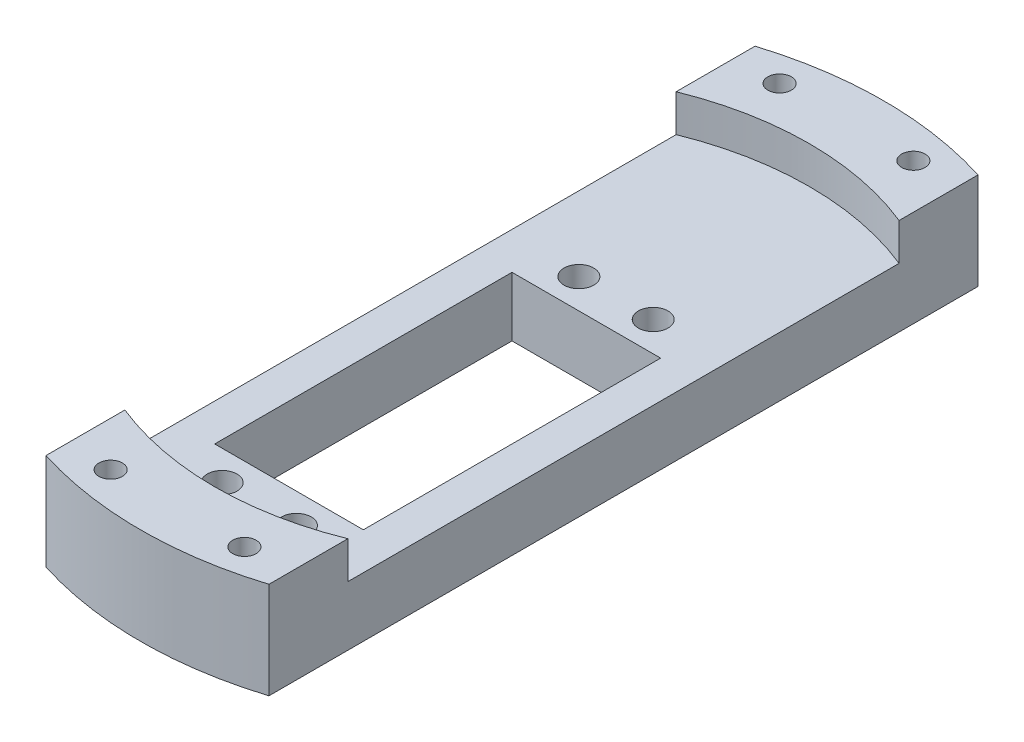
ISO-10303-21;
HEADER;
FILE_DESCRIPTION(('STEP AP214'),'2;1');
FILE_NAME('part.step','',(''),(''),'','','');
FILE_SCHEMA(('AUTOMOTIVE_DESIGN { 1 0 10303 214 1 1 1 1 }'));
ENDSEC;
DATA;
#1=APPLICATION_CONTEXT('core data for automotive mechanical design processes');
#2=APPLICATION_PROTOCOL_DEFINITION('international standard','automotive_design',2000,#1);
#3=PRODUCT_CONTEXT('',#1,'mechanical');
#4=PRODUCT('Part','Part','',(#3));
#5=PRODUCT_RELATED_PRODUCT_CATEGORY('part','',(#4));
#6=PRODUCT_DEFINITION_FORMATION('','',#4);
#7=PRODUCT_DEFINITION_CONTEXT('part definition',#1,'design');
#8=PRODUCT_DEFINITION('design','',#6,#7);
#9=PRODUCT_DEFINITION_SHAPE('','',#8);
#10=(LENGTH_UNIT() NAMED_UNIT(*) SI_UNIT(.MILLI.,.METRE.));
#11=(NAMED_UNIT(*) PLANE_ANGLE_UNIT() SI_UNIT($,.RADIAN.));
#12=(NAMED_UNIT(*) SI_UNIT($,.STERADIAN.) SOLID_ANGLE_UNIT());
#13=UNCERTAINTY_MEASURE_WITH_UNIT(LENGTH_MEASURE(1.E-05),#10,'distance_accuracy_value','');
#14=(GEOMETRIC_REPRESENTATION_CONTEXT(3) GLOBAL_UNCERTAINTY_ASSIGNED_CONTEXT((#13)) GLOBAL_UNIT_ASSIGNED_CONTEXT((#10,
#11,#12)) REPRESENTATION_CONTEXT('',''));
#15=CARTESIAN_POINT('',(0.,0.,0.));
#16=DIRECTION('',(0.,0.,1.));
#17=DIRECTION('',(1.,0.,0.));
#18=AXIS2_PLACEMENT_3D('',#15,#16,#17);
#19=CARTESIAN_POINT('',(0.,8.,0.));
#20=DIRECTION('',(0.,1.,0.));
#21=DIRECTION('',(0.,0.,1.));
#22=AXIS2_PLACEMENT_3D('',#19,#20,#21);
#23=PLANE('',#22);
#24=CARTESIAN_POINT('',(-5.,8.,-14.));
#25=DIRECTION('',(0.,1.,0.));
#26=DIRECTION('',(0.,0.,-1.));
#27=AXIS2_PLACEMENT_3D('',#24,#25,#26);
#28=CIRCLE('',#27,2.);
#29=CARTESIAN_POINT('',(-5.,8.,-16.));
#30=VERTEX_POINT('',#29);
#31=EDGE_CURVE('E170',#30,#30,#28,.T.);
#32=ORIENTED_EDGE('',*,*,#31,.F.);
#33=EDGE_LOOP('',(#32));
#34=FACE_BOUND('',#33,.T.);
#35=CARTESIAN_POINT('',(5.,8.,34.));
#36=DIRECTION('',(0.,1.,0.));
#37=DIRECTION('',(0.,0.,-1.));
#38=AXIS2_PLACEMENT_3D('',#35,#36,#37);
#39=CIRCLE('',#38,2.);
#40=CARTESIAN_POINT('',(5.,8.,32.));
#41=VERTEX_POINT('',#40);
#42=EDGE_CURVE('E182',#41,#41,#39,.T.);
#43=ORIENTED_EDGE('',*,*,#42,.F.);
#44=EDGE_LOOP('',(#43));
#45=FACE_BOUND('',#44,.T.);
#46=DIRECTION('',(-1.,0.,0.));
#47=VECTOR('',#46,1.);
#48=CARTESIAN_POINT('',(-10.,8.,-10.));
#49=LINE('',#48,#47);
#50=CARTESIAN_POINT('',(10.,8.,-10.));
#51=VERTEX_POINT('',#50);
#52=CARTESIAN_POINT('',(-10.,8.,-10.));
#53=VERTEX_POINT('',#52);
#54=EDGE_CURVE('E196',#51,#53,#49,.T.);
#55=ORIENTED_EDGE('',*,*,#54,.F.);
#56=DIRECTION('',(0.,0.,-1.));
#57=VECTOR('',#56,1.);
#58=CARTESIAN_POINT('',(10.,8.,30.));
#59=LINE('',#58,#57);
#60=CARTESIAN_POINT('',(10.,8.,30.));
#61=VERTEX_POINT('',#60);
#62=EDGE_CURVE('E194',#61,#51,#59,.T.);
#63=ORIENTED_EDGE('',*,*,#62,.F.);
#64=DIRECTION('',(1.,0.,0.));
#65=VECTOR('',#64,1.);
#66=CARTESIAN_POINT('',(-10.,8.,30.));
#67=LINE('',#66,#65);
#68=CARTESIAN_POINT('',(-10.,8.,30.));
#69=VERTEX_POINT('',#68);
#70=EDGE_CURVE('E202',#69,#61,#67,.T.);
#71=ORIENTED_EDGE('',*,*,#70,.F.);
#72=DIRECTION('',(0.,0.,1.));
#73=VECTOR('',#72,1.);
#74=CARTESIAN_POINT('',(-10.,8.,30.));
#75=LINE('',#74,#73);
#76=EDGE_CURVE('E199',#53,#69,#75,.T.);
#77=ORIENTED_EDGE('',*,*,#76,.F.);
#78=EDGE_LOOP('',(#55,#63,#71,#77));
#79=FACE_BOUND('',#78,.T.);
#80=CARTESIAN_POINT('',(-5.,8.,34.));
#81=DIRECTION('',(0.,1.,0.));
#82=DIRECTION('',(0.,0.,1.));
#83=AXIS2_PLACEMENT_3D('',#80,#81,#82);
#84=CIRCLE('',#83,2.);
#85=CARTESIAN_POINT('',(-5.,8.,36.));
#86=VERTEX_POINT('',#85);
#87=EDGE_CURVE('E188',#86,#86,#84,.T.);
#88=ORIENTED_EDGE('',*,*,#87,.F.);
#89=EDGE_LOOP('',(#88));
#90=FACE_BOUND('',#89,.T.);
#91=CARTESIAN_POINT('',(5.,8.,-14.));
#92=DIRECTION('',(0.,1.,0.));
#93=DIRECTION('',(0.,0.,1.));
#94=AXIS2_PLACEMENT_3D('',#91,#92,#93);
#95=CIRCLE('',#94,2.);
#96=CARTESIAN_POINT('',(5.,8.,-12.));
#97=VERTEX_POINT('',#96);
#98=EDGE_CURVE('E176',#97,#97,#95,.T.);
#99=ORIENTED_EDGE('',*,*,#98,.F.);
#100=EDGE_LOOP('',(#99));
#101=FACE_BOUND('',#100,.T.);
#102=DIRECTION('',(0.,0.,1.));
#103=VECTOR('',#102,1.);
#104=CARTESIAN_POINT('',(-15.,8.,47.6969600708473));
#105=LINE('',#104,#103);
#106=CARTESIAN_POINT('',(-15.,8.,-37.0809924354783));
#107=VERTEX_POINT('',#106);
#108=CARTESIAN_POINT('',(-15.,8.,37.0809924354783));
#109=VERTEX_POINT('',#108);
#110=EDGE_CURVE('E55',#107,#109,#105,.T.);
#111=ORIENTED_EDGE('',*,*,#110,.T.);
#112=CARTESIAN_POINT('',(0.,8.,0.));
#113=DIRECTION('',(0.,-1.,0.));
#114=DIRECTION('',(0.,0.,1.));
#115=AXIS2_PLACEMENT_3D('',#112,#113,#114);
#116=CIRCLE('',#115,40.);
#117=CARTESIAN_POINT('',(15.,8.,37.0809924354783));
#118=VERTEX_POINT('',#117);
#119=EDGE_CURVE('E50',#118,#109,#116,.T.);
#120=ORIENTED_EDGE('',*,*,#119,.F.);
#121=DIRECTION('',(0.,0.,-1.));
#122=VECTOR('',#121,1.);
#123=CARTESIAN_POINT('',(15.,8.,47.6969600708473));
#124=LINE('',#123,#122);
#125=CARTESIAN_POINT('',(15.,8.,-37.0809924354783));
#126=VERTEX_POINT('',#125);
#127=EDGE_CURVE('E225',#118,#126,#124,.T.);
#128=ORIENTED_EDGE('',*,*,#127,.T.);
#129=CARTESIAN_POINT('',(0.,8.,0.));
#130=DIRECTION('',(0.,-1.,0.));
#131=DIRECTION('',(0.,0.,1.));
#132=AXIS2_PLACEMENT_3D('',#129,#130,#131);
#133=CIRCLE('',#132,40.);
#134=EDGE_CURVE('E144',#107,#126,#133,.T.);
#135=ORIENTED_EDGE('',*,*,#134,.F.);
#136=EDGE_LOOP('',(#111,#120,#128,#135));
#137=FACE_BOUND('',#136,.T.);
#138=ADVANCED_FACE('F35',(#34,#45,#79,#90,#101,#137),#23,.T.);
#139=CARTESIAN_POINT('',(0.,0.,0.));
#140=DIRECTION('',(0.,1.,0.));
#141=DIRECTION('',(0.,0.,1.));
#142=AXIS2_PLACEMENT_3D('',#139,#140,#141);
#143=PLANE('',#142);
#144=CARTESIAN_POINT('',(9.00000000000001,0.,-45.));
#145=DIRECTION('',(0.,1.,0.));
#146=DIRECTION('',(0.,0.,1.));
#147=AXIS2_PLACEMENT_3D('',#144,#145,#146);
#148=CIRCLE('',#147,1.575);
#149=CARTESIAN_POINT('',(9.00000000000001,0.,-43.425));
#150=VERTEX_POINT('',#149);
#151=EDGE_CURVE('E275',#150,#150,#148,.T.);
#152=ORIENTED_EDGE('',*,*,#151,.T.);
#153=EDGE_LOOP('',(#152));
#154=FACE_BOUND('',#153,.T.);
#155=CARTESIAN_POINT('',(9.00000000000001,0.,45.));
#156=DIRECTION('',(0.,1.,0.));
#157=DIRECTION('',(0.,0.,1.));
#158=AXIS2_PLACEMENT_3D('',#155,#156,#157);
#159=CIRCLE('',#158,1.575);
#160=CARTESIAN_POINT('',(9.00000000000001,0.,46.575));
#161=VERTEX_POINT('',#160);
#162=EDGE_CURVE('E269',#161,#161,#159,.T.);
#163=ORIENTED_EDGE('',*,*,#162,.T.);
#164=EDGE_LOOP('',(#163));
#165=FACE_BOUND('',#164,.T.);
#166=CARTESIAN_POINT('',(-8.99999999999999,0.,-45.));
#167=DIRECTION('',(0.,1.,0.));
#168=DIRECTION('',(0.,0.,1.));
#169=AXIS2_PLACEMENT_3D('',#166,#167,#168);
#170=CIRCLE('',#169,1.575);
#171=CARTESIAN_POINT('',(-8.99999999999999,0.,-43.425));
#172=VERTEX_POINT('',#171);
#173=EDGE_CURVE('E261',#172,#172,#170,.T.);
#174=ORIENTED_EDGE('',*,*,#173,.T.);
#175=EDGE_LOOP('',(#174));
#176=FACE_BOUND('',#175,.T.);
#177=CARTESIAN_POINT('',(-8.99999999999999,0.,45.));
#178=DIRECTION('',(0.,1.,0.));
#179=DIRECTION('',(0.,0.,1.));
#180=AXIS2_PLACEMENT_3D('',#177,#178,#179);
#181=CIRCLE('',#180,1.575);
#182=CARTESIAN_POINT('',(-8.99999999999999,0.,46.575));
#183=VERTEX_POINT('',#182);
#184=EDGE_CURVE('E254',#183,#183,#181,.T.);
#185=ORIENTED_EDGE('',*,*,#184,.T.);
#186=EDGE_LOOP('',(#185));
#187=FACE_BOUND('',#186,.T.);
#188=CARTESIAN_POINT('',(0.,0.,0.));
#189=DIRECTION('',(0.,1.,0.));
#190=DIRECTION('',(0.,0.,1.));
#191=AXIS2_PLACEMENT_3D('',#188,#189,#190);
#192=CIRCLE('',#191,50.);
#193=CARTESIAN_POINT('',(-15.,0.,47.6969600708473));
#194=VERTEX_POINT('',#193);
#195=CARTESIAN_POINT('',(15.,0.,47.6969600708473));
#196=VERTEX_POINT('',#195);
#197=EDGE_CURVE('E224',#194,#196,#192,.T.);
#198=ORIENTED_EDGE('',*,*,#197,.F.);
#199=DIRECTION('',(0.,0.,1.));
#200=VECTOR('',#199,1.);
#201=CARTESIAN_POINT('',(-15.,0.,47.6969600708473));
#202=LINE('',#201,#200);
#203=CARTESIAN_POINT('',(-15.,0.,-47.6969600708473));
#204=VERTEX_POINT('',#203);
#205=EDGE_CURVE('E227',#204,#194,#202,.T.);
#206=ORIENTED_EDGE('',*,*,#205,.F.);
#207=CARTESIAN_POINT('',(0.,0.,0.));
#208=DIRECTION('',(0.,1.,0.));
#209=DIRECTION('',(0.,0.,1.));
#210=AXIS2_PLACEMENT_3D('',#207,#208,#209);
#211=CIRCLE('',#210,50.);
#212=CARTESIAN_POINT('',(15.,0.,-47.6969600708473));
#213=VERTEX_POINT('',#212);
#214=EDGE_CURVE('E233',#213,#204,#211,.T.);
#215=ORIENTED_EDGE('',*,*,#214,.F.);
#216=DIRECTION('',(0.,0.,-1.));
#217=VECTOR('',#216,1.);
#218=CARTESIAN_POINT('',(15.,0.,47.6969600708473));
#219=LINE('',#218,#217);
#220=EDGE_CURVE('E231',#196,#213,#219,.T.);
#221=ORIENTED_EDGE('',*,*,#220,.F.);
#222=EDGE_LOOP('',(#198,#206,#215,#221));
#223=FACE_BOUND('',#222,.T.);
#224=DIRECTION('',(0.,0.,-1.));
#225=VECTOR('',#224,1.);
#226=CARTESIAN_POINT('',(10.,0.,30.));
#227=LINE('',#226,#225);
#228=CARTESIAN_POINT('',(10.,0.,30.));
#229=VERTEX_POINT('',#228);
#230=CARTESIAN_POINT('',(10.,0.,-10.));
#231=VERTEX_POINT('',#230);
#232=EDGE_CURVE('E191',#229,#231,#227,.T.);
#233=ORIENTED_EDGE('',*,*,#232,.T.);
#234=DIRECTION('',(-1.,0.,0.));
#235=VECTOR('',#234,1.);
#236=CARTESIAN_POINT('',(-10.,0.,-10.));
#237=LINE('',#236,#235);
#238=CARTESIAN_POINT('',(-10.,0.,-10.));
#239=VERTEX_POINT('',#238);
#240=EDGE_CURVE('E207',#231,#239,#237,.T.);
#241=ORIENTED_EDGE('',*,*,#240,.T.);
#242=DIRECTION('',(0.,0.,1.));
#243=VECTOR('',#242,1.);
#244=CARTESIAN_POINT('',(-10.,0.,30.));
#245=LINE('',#244,#243);
#246=CARTESIAN_POINT('',(-10.,0.,30.));
#247=VERTEX_POINT('',#246);
#248=EDGE_CURVE('E210',#239,#247,#245,.T.);
#249=ORIENTED_EDGE('',*,*,#248,.T.);
#250=DIRECTION('',(1.,0.,0.));
#251=VECTOR('',#250,1.);
#252=CARTESIAN_POINT('',(-10.,0.,30.));
#253=LINE('',#252,#251);
#254=EDGE_CURVE('E197',#247,#229,#253,.T.);
#255=ORIENTED_EDGE('',*,*,#254,.T.);
#256=EDGE_LOOP('',(#233,#241,#249,#255));
#257=FACE_BOUND('',#256,.T.);
#258=CARTESIAN_POINT('',(-5.,0.,34.));
#259=DIRECTION('',(0.,1.,0.));
#260=DIRECTION('',(0.,0.,1.));
#261=AXIS2_PLACEMENT_3D('',#258,#259,#260);
#262=CIRCLE('',#261,2.);
#263=CARTESIAN_POINT('',(-5.,0.,36.));
#264=VERTEX_POINT('',#263);
#265=EDGE_CURVE('E185',#264,#264,#262,.T.);
#266=ORIENTED_EDGE('',*,*,#265,.T.);
#267=EDGE_LOOP('',(#266));
#268=FACE_BOUND('',#267,.T.);
#269=CARTESIAN_POINT('',(5.,0.,34.));
#270=DIRECTION('',(0.,1.,0.));
#271=DIRECTION('',(0.,0.,-1.));
#272=AXIS2_PLACEMENT_3D('',#269,#270,#271);
#273=CIRCLE('',#272,2.);
#274=CARTESIAN_POINT('',(5.,0.,32.));
#275=VERTEX_POINT('',#274);
#276=EDGE_CURVE('E179',#275,#275,#273,.T.);
#277=ORIENTED_EDGE('',*,*,#276,.T.);
#278=EDGE_LOOP('',(#277));
#279=FACE_BOUND('',#278,.T.);
#280=CARTESIAN_POINT('',(5.,0.,-14.));
#281=DIRECTION('',(0.,1.,0.));
#282=DIRECTION('',(0.,0.,1.));
#283=AXIS2_PLACEMENT_3D('',#280,#281,#282);
#284=CIRCLE('',#283,2.);
#285=CARTESIAN_POINT('',(5.,0.,-12.));
#286=VERTEX_POINT('',#285);
#287=EDGE_CURVE('E173',#286,#286,#284,.T.);
#288=ORIENTED_EDGE('',*,*,#287,.T.);
#289=EDGE_LOOP('',(#288));
#290=FACE_BOUND('',#289,.T.);
#291=CARTESIAN_POINT('',(-5.,0.,-14.));
#292=DIRECTION('',(0.,1.,0.));
#293=DIRECTION('',(0.,0.,-1.));
#294=AXIS2_PLACEMENT_3D('',#291,#292,#293);
#295=CIRCLE('',#294,2.);
#296=CARTESIAN_POINT('',(-5.,0.,-16.));
#297=VERTEX_POINT('',#296);
#298=EDGE_CURVE('E169',#297,#297,#295,.T.);
#299=ORIENTED_EDGE('',*,*,#298,.T.);
#300=EDGE_LOOP('',(#299));
#301=FACE_BOUND('',#300,.T.);
#302=ADVANCED_FACE('F248',(#154,#165,#176,#187,#223,#257,#268,#279,#290,#301),#143,.F.);
#303=CARTESIAN_POINT('',(0.,8.,0.));
#304=DIRECTION('',(0.,-1.,0.));
#305=DIRECTION('',(0.,0.,-1.));
#306=AXIS2_PLACEMENT_3D('',#303,#304,#305);
#307=CYLINDRICAL_SURFACE('',#306,50.);
#308=ORIENTED_EDGE('',*,*,#197,.T.);
#309=DIRECTION('',(0.,-1.,0.));
#310=VECTOR('',#309,1.);
#311=CARTESIAN_POINT('',(15.,8.,47.6969600708473));
#312=LINE('',#311,#310);
#313=CARTESIAN_POINT('',(15.,13.,47.6969600708473));
#314=VERTEX_POINT('',#313);
#315=EDGE_CURVE('E11',#314,#196,#312,.T.);
#316=ORIENTED_EDGE('',*,*,#315,.F.);
#317=CARTESIAN_POINT('',(0.,13.,0.));
#318=DIRECTION('',(0.,1.,0.));
#319=DIRECTION('',(0.,0.,1.));
#320=AXIS2_PLACEMENT_3D('',#317,#318,#319);
#321=CIRCLE('',#320,50.);
#322=CARTESIAN_POINT('',(-15.,13.,47.6969600708473));
#323=VERTEX_POINT('',#322);
#324=EDGE_CURVE('E132',#323,#314,#321,.T.);
#325=ORIENTED_EDGE('',*,*,#324,.F.);
#326=DIRECTION('',(0.,-1.,0.));
#327=VECTOR('',#326,1.);
#328=CARTESIAN_POINT('',(-15.,8.,47.6969600708473));
#329=LINE('',#328,#327);
#330=EDGE_CURVE('E128',#323,#194,#329,.T.);
#331=ORIENTED_EDGE('',*,*,#330,.T.);
#332=EDGE_LOOP('',(#308,#316,#325,#331));
#333=FACE_BOUND('',#332,.T.);
#334=ADVANCED_FACE('F37',(#333),#307,.T.);
#335=CARTESIAN_POINT('',(15.,8.,47.6969600708473));
#336=DIRECTION('',(-1.,0.,0.));
#337=DIRECTION('',(0.,0.,1.));
#338=AXIS2_PLACEMENT_3D('',#335,#336,#337);
#339=PLANE('',#338);
#340=ORIENTED_EDGE('',*,*,#220,.T.);
#341=DIRECTION('',(0.,-1.,0.));
#342=VECTOR('',#341,1.);
#343=CARTESIAN_POINT('',(15.,8.,-47.6969600708473));
#344=LINE('',#343,#342);
#345=CARTESIAN_POINT('',(15.,13.,-47.6969600708473));
#346=VERTEX_POINT('',#345);
#347=EDGE_CURVE('E43',#346,#213,#344,.T.);
#348=ORIENTED_EDGE('',*,*,#347,.F.);
#349=DIRECTION('',(0.,0.,-1.));
#350=VECTOR('',#349,1.);
#351=CARTESIAN_POINT('',(15.,13.,-47.6969600708473));
#352=LINE('',#351,#350);
#353=CARTESIAN_POINT('',(15.,13.,-37.0809924354783));
#354=VERTEX_POINT('',#353);
#355=EDGE_CURVE('E155',#354,#346,#352,.T.);
#356=ORIENTED_EDGE('',*,*,#355,.F.);
#357=DIRECTION('',(0.,-1.,0.));
#358=VECTOR('',#357,1.);
#359=CARTESIAN_POINT('',(15.,13.,-37.0809924354783));
#360=LINE('',#359,#358);
#361=EDGE_CURVE('E166',#354,#126,#360,.T.);
#362=ORIENTED_EDGE('',*,*,#361,.T.);
#363=ORIENTED_EDGE('',*,*,#127,.F.);
#364=DIRECTION('',(0.,-1.,0.));
#365=VECTOR('',#364,1.);
#366=CARTESIAN_POINT('',(15.,13.,37.0809924354783));
#367=LINE('',#366,#365);
#368=CARTESIAN_POINT('',(15.,13.,37.0809924354783));
#369=VERTEX_POINT('',#368);
#370=EDGE_CURVE('E145',#369,#118,#367,.T.);
#371=ORIENTED_EDGE('',*,*,#370,.F.);
#372=DIRECTION('',(0.,0.,-1.));
#373=VECTOR('',#372,1.);
#374=CARTESIAN_POINT('',(15.,13.,37.0809924354783));
#375=LINE('',#374,#373);
#376=EDGE_CURVE('E138',#314,#369,#375,.T.);
#377=ORIENTED_EDGE('',*,*,#376,.F.);
#378=ORIENTED_EDGE('',*,*,#315,.T.);
#379=EDGE_LOOP('',(#340,#348,#356,#362,#363,#371,#377,#378));
#380=FACE_BOUND('',#379,.T.);
#381=ADVANCED_FACE('F295',(#380),#339,.F.);
#382=CARTESIAN_POINT('',(0.,8.,0.));
#383=DIRECTION('',(0.,-1.,0.));
#384=DIRECTION('',(0.,0.,-1.));
#385=AXIS2_PLACEMENT_3D('',#382,#383,#384);
#386=CYLINDRICAL_SURFACE('',#385,50.);
#387=ORIENTED_EDGE('',*,*,#214,.T.);
#388=DIRECTION('',(0.,-1.,0.));
#389=VECTOR('',#388,1.);
#390=CARTESIAN_POINT('',(-15.,8.,-47.6969600708473));
#391=LINE('',#390,#389);
#392=CARTESIAN_POINT('',(-15.,13.,-47.6969600708473));
#393=VERTEX_POINT('',#392);
#394=EDGE_CURVE('E237',#393,#204,#391,.T.);
#395=ORIENTED_EDGE('',*,*,#394,.F.);
#396=CARTESIAN_POINT('',(0.,13.,0.));
#397=DIRECTION('',(0.,1.,0.));
#398=DIRECTION('',(0.,0.,1.));
#399=AXIS2_PLACEMENT_3D('',#396,#397,#398);
#400=CIRCLE('',#399,50.);
#401=EDGE_CURVE('E158',#346,#393,#400,.T.);
#402=ORIENTED_EDGE('',*,*,#401,.F.);
#403=ORIENTED_EDGE('',*,*,#347,.T.);
#404=EDGE_LOOP('',(#387,#395,#402,#403));
#405=FACE_BOUND('',#404,.T.);
#406=ADVANCED_FACE('F243',(#405),#386,.T.);
#407=CARTESIAN_POINT('',(-15.,8.,47.6969600708473));
#408=DIRECTION('',(1.,0.,0.));
#409=DIRECTION('',(0.,0.,-1.));
#410=AXIS2_PLACEMENT_3D('',#407,#408,#409);
#411=PLANE('',#410);
#412=ORIENTED_EDGE('',*,*,#205,.T.);
#413=ORIENTED_EDGE('',*,*,#330,.F.);
#414=DIRECTION('',(0.,0.,1.));
#415=VECTOR('',#414,1.);
#416=CARTESIAN_POINT('',(-15.,13.,37.0809924354783));
#417=LINE('',#416,#415);
#418=CARTESIAN_POINT('',(-15.,13.,37.0809924354783));
#419=VERTEX_POINT('',#418);
#420=EDGE_CURVE('E122',#419,#323,#417,.T.);
#421=ORIENTED_EDGE('',*,*,#420,.F.);
#422=DIRECTION('',(0.,-1.,0.));
#423=VECTOR('',#422,1.);
#424=CARTESIAN_POINT('',(-15.,13.,37.0809924354783));
#425=LINE('',#424,#423);
#426=EDGE_CURVE('E126',#419,#109,#425,.T.);
#427=ORIENTED_EDGE('',*,*,#426,.T.);
#428=ORIENTED_EDGE('',*,*,#110,.F.);
#429=DIRECTION('',(0.,-1.,0.));
#430=VECTOR('',#429,1.);
#431=CARTESIAN_POINT('',(-15.,13.,-37.0809924354783));
#432=LINE('',#431,#430);
#433=CARTESIAN_POINT('',(-15.,13.,-37.0809924354783));
#434=VERTEX_POINT('',#433);
#435=EDGE_CURVE('E162',#434,#107,#432,.T.);
#436=ORIENTED_EDGE('',*,*,#435,.F.);
#437=DIRECTION('',(0.,0.,1.));
#438=VECTOR('',#437,1.);
#439=CARTESIAN_POINT('',(-15.,13.,-37.0809924354783));
#440=LINE('',#439,#438);
#441=EDGE_CURVE('E161',#393,#434,#440,.T.);
#442=ORIENTED_EDGE('',*,*,#441,.F.);
#443=ORIENTED_EDGE('',*,*,#394,.T.);
#444=EDGE_LOOP('',(#412,#413,#421,#427,#428,#436,#442,#443));
#445=FACE_BOUND('',#444,.T.);
#446=ADVANCED_FACE('F124',(#445),#411,.F.);
#447=CARTESIAN_POINT('',(10.,8.,30.));
#448=DIRECTION('',(-1.,0.,0.));
#449=DIRECTION('',(0.,0.,1.));
#450=AXIS2_PLACEMENT_3D('',#447,#448,#449);
#451=PLANE('',#450);
#452=ORIENTED_EDGE('',*,*,#232,.F.);
#453=DIRECTION('',(0.,-1.,0.));
#454=VECTOR('',#453,1.);
#455=CARTESIAN_POINT('',(10.,8.,30.));
#456=LINE('',#455,#454);
#457=EDGE_CURVE('E204',#61,#229,#456,.T.);
#458=ORIENTED_EDGE('',*,*,#457,.F.);
#459=ORIENTED_EDGE('',*,*,#62,.T.);
#460=DIRECTION('',(0.,-1.,0.));
#461=VECTOR('',#460,1.);
#462=CARTESIAN_POINT('',(10.,8.,-10.));
#463=LINE('',#462,#461);
#464=EDGE_CURVE('E221',#51,#231,#463,.T.);
#465=ORIENTED_EDGE('',*,*,#464,.T.);
#466=EDGE_LOOP('',(#452,#458,#459,#465));
#467=FACE_BOUND('',#466,.T.);
#468=ADVANCED_FACE('F307',(#467),#451,.T.);
#469=CARTESIAN_POINT('',(-10.,8.,-10.));
#470=DIRECTION('',(0.,0.,1.));
#471=DIRECTION('',(1.,0.,0.));
#472=AXIS2_PLACEMENT_3D('',#469,#470,#471);
#473=PLANE('',#472);
#474=ORIENTED_EDGE('',*,*,#240,.F.);
#475=ORIENTED_EDGE('',*,*,#464,.F.);
#476=ORIENTED_EDGE('',*,*,#54,.T.);
#477=DIRECTION('',(0.,-1.,0.));
#478=VECTOR('',#477,1.);
#479=CARTESIAN_POINT('',(-10.,8.,-10.));
#480=LINE('',#479,#478);
#481=EDGE_CURVE('E219',#53,#239,#480,.T.);
#482=ORIENTED_EDGE('',*,*,#481,.T.);
#483=EDGE_LOOP('',(#474,#475,#476,#482));
#484=FACE_BOUND('',#483,.T.);
#485=ADVANCED_FACE('F410',(#484),#473,.T.);
#486=CARTESIAN_POINT('',(-10.,8.,30.));
#487=DIRECTION('',(1.,0.,0.));
#488=DIRECTION('',(0.,0.,-1.));
#489=AXIS2_PLACEMENT_3D('',#486,#487,#488);
#490=PLANE('',#489);
#491=ORIENTED_EDGE('',*,*,#248,.F.);
#492=ORIENTED_EDGE('',*,*,#481,.F.);
#493=ORIENTED_EDGE('',*,*,#76,.T.);
#494=DIRECTION('',(0.,-1.,0.));
#495=VECTOR('',#494,1.);
#496=CARTESIAN_POINT('',(-10.,8.,30.));
#497=LINE('',#496,#495);
#498=EDGE_CURVE('E217',#69,#247,#497,.T.);
#499=ORIENTED_EDGE('',*,*,#498,.T.);
#500=EDGE_LOOP('',(#491,#492,#493,#499));
#501=FACE_BOUND('',#500,.T.);
#502=ADVANCED_FACE('F407',(#501),#490,.T.);
#503=CARTESIAN_POINT('',(-10.,8.,30.));
#504=DIRECTION('',(0.,0.,-1.));
#505=DIRECTION('',(-1.,0.,0.));
#506=AXIS2_PLACEMENT_3D('',#503,#504,#505);
#507=PLANE('',#506);
#508=ORIENTED_EDGE('',*,*,#254,.F.);
#509=ORIENTED_EDGE('',*,*,#498,.F.);
#510=ORIENTED_EDGE('',*,*,#70,.T.);
#511=ORIENTED_EDGE('',*,*,#457,.T.);
#512=EDGE_LOOP('',(#508,#509,#510,#511));
#513=FACE_BOUND('',#512,.T.);
#514=ADVANCED_FACE('F403',(#513),#507,.T.);
#515=CARTESIAN_POINT('',(-5.,8.,34.));
#516=DIRECTION('',(0.,-1.,0.));
#517=DIRECTION('',(0.,0.,-1.));
#518=AXIS2_PLACEMENT_3D('',#515,#516,#517);
#519=CYLINDRICAL_SURFACE('',#518,2.);
#520=ORIENTED_EDGE('',*,*,#87,.T.);
#521=EDGE_LOOP('',(#520));
#522=FACE_BOUND('',#521,.T.);
#523=ORIENTED_EDGE('',*,*,#265,.F.);
#524=EDGE_LOOP('',(#523));
#525=FACE_BOUND('',#524,.T.);
#526=ADVANCED_FACE('F399',(#522,#525),#519,.F.);
#527=CARTESIAN_POINT('',(5.,8.,34.));
#528=DIRECTION('',(0.,-1.,0.));
#529=DIRECTION('',(0.,0.,-1.));
#530=AXIS2_PLACEMENT_3D('',#527,#528,#529);
#531=CYLINDRICAL_SURFACE('',#530,2.);
#532=ORIENTED_EDGE('',*,*,#42,.T.);
#533=EDGE_LOOP('',(#532));
#534=FACE_BOUND('',#533,.T.);
#535=ORIENTED_EDGE('',*,*,#276,.F.);
#536=EDGE_LOOP('',(#535));
#537=FACE_BOUND('',#536,.T.);
#538=ADVANCED_FACE('F395',(#534,#537),#531,.F.);
#539=CARTESIAN_POINT('',(5.,8.,-14.));
#540=DIRECTION('',(0.,-1.,0.));
#541=DIRECTION('',(0.,0.,-1.));
#542=AXIS2_PLACEMENT_3D('',#539,#540,#541);
#543=CYLINDRICAL_SURFACE('',#542,2.);
#544=ORIENTED_EDGE('',*,*,#98,.T.);
#545=EDGE_LOOP('',(#544));
#546=FACE_BOUND('',#545,.T.);
#547=ORIENTED_EDGE('',*,*,#287,.F.);
#548=EDGE_LOOP('',(#547));
#549=FACE_BOUND('',#548,.T.);
#550=ADVANCED_FACE('F391',(#546,#549),#543,.F.);
#551=CARTESIAN_POINT('',(-5.,8.,-14.));
#552=DIRECTION('',(0.,-1.,0.));
#553=DIRECTION('',(0.,0.,-1.));
#554=AXIS2_PLACEMENT_3D('',#551,#552,#553);
#555=CYLINDRICAL_SURFACE('',#554,2.);
#556=ORIENTED_EDGE('',*,*,#31,.T.);
#557=EDGE_LOOP('',(#556));
#558=FACE_BOUND('',#557,.T.);
#559=ORIENTED_EDGE('',*,*,#298,.F.);
#560=EDGE_LOOP('',(#559));
#561=FACE_BOUND('',#560,.T.);
#562=ADVANCED_FACE('F388',(#558,#561),#555,.F.);
#563=CARTESIAN_POINT('',(0.,13.,0.));
#564=DIRECTION('',(0.,-1.,0.));
#565=DIRECTION('',(0.,0.,-1.));
#566=AXIS2_PLACEMENT_3D('',#563,#564,#565);
#567=CYLINDRICAL_SURFACE('',#566,40.);
#568=ORIENTED_EDGE('',*,*,#134,.T.);
#569=ORIENTED_EDGE('',*,*,#361,.F.);
#570=CARTESIAN_POINT('',(0.,13.,0.));
#571=DIRECTION('',(0.,-1.,0.));
#572=DIRECTION('',(0.,0.,1.));
#573=AXIS2_PLACEMENT_3D('',#570,#571,#572);
#574=CIRCLE('',#573,40.);
#575=EDGE_CURVE('E148',#434,#354,#574,.T.);
#576=ORIENTED_EDGE('',*,*,#575,.F.);
#577=ORIENTED_EDGE('',*,*,#435,.T.);
#578=EDGE_LOOP('',(#568,#569,#576,#577));
#579=FACE_BOUND('',#578,.T.);
#580=ADVANCED_FACE('F287',(#579),#567,.F.);
#581=CARTESIAN_POINT('',(0.,13.,0.));
#582=DIRECTION('',(0.,1.,0.));
#583=DIRECTION('',(0.,0.,1.));
#584=AXIS2_PLACEMENT_3D('',#581,#582,#583);
#585=PLANE('',#584);
#586=CARTESIAN_POINT('',(9.00000000000001,13.,-45.));
#587=DIRECTION('',(0.,1.,0.));
#588=DIRECTION('',(0.,0.,1.));
#589=AXIS2_PLACEMENT_3D('',#586,#587,#588);
#590=CIRCLE('',#589,1.57499999999999);
#591=CARTESIAN_POINT('',(9.00000000000001,13.,-43.425));
#592=VERTEX_POINT('',#591);
#593=EDGE_CURVE('E278',#592,#592,#590,.T.);
#594=ORIENTED_EDGE('',*,*,#593,.F.);
#595=EDGE_LOOP('',(#594));
#596=FACE_BOUND('',#595,.T.);
#597=CARTESIAN_POINT('',(-8.99999999999999,13.,-45.));
#598=DIRECTION('',(0.,1.,0.));
#599=DIRECTION('',(0.,0.,1.));
#600=AXIS2_PLACEMENT_3D('',#597,#598,#599);
#601=CIRCLE('',#600,1.57499999999999);
#602=CARTESIAN_POINT('',(-8.99999999999999,13.,-43.425));
#603=VERTEX_POINT('',#602);
#604=EDGE_CURVE('E266',#603,#603,#601,.T.);
#605=ORIENTED_EDGE('',*,*,#604,.F.);
#606=EDGE_LOOP('',(#605));
#607=FACE_BOUND('',#606,.T.);
#608=ORIENTED_EDGE('',*,*,#575,.T.);
#609=ORIENTED_EDGE('',*,*,#355,.T.);
#610=ORIENTED_EDGE('',*,*,#401,.T.);
#611=ORIENTED_EDGE('',*,*,#441,.T.);
#612=EDGE_LOOP('',(#608,#609,#610,#611));
#613=FACE_BOUND('',#612,.T.);
#614=ADVANCED_FACE('F284',(#596,#607,#613),#585,.T.);
#615=CARTESIAN_POINT('',(0.,13.,0.));
#616=DIRECTION('',(0.,-1.,0.));
#617=DIRECTION('',(0.,0.,-1.));
#618=AXIS2_PLACEMENT_3D('',#615,#616,#617);
#619=CYLINDRICAL_SURFACE('',#618,40.);
#620=ORIENTED_EDGE('',*,*,#119,.T.);
#621=ORIENTED_EDGE('',*,*,#426,.F.);
#622=CARTESIAN_POINT('',(0.,13.,0.));
#623=DIRECTION('',(0.,-1.,0.));
#624=DIRECTION('',(0.,0.,1.));
#625=AXIS2_PLACEMENT_3D('',#622,#623,#624);
#626=CIRCLE('',#625,40.);
#627=EDGE_CURVE('E133',#369,#419,#626,.T.);
#628=ORIENTED_EDGE('',*,*,#627,.F.);
#629=ORIENTED_EDGE('',*,*,#370,.T.);
#630=EDGE_LOOP('',(#620,#621,#628,#629));
#631=FACE_BOUND('',#630,.T.);
#632=ADVANCED_FACE('F143',(#631),#619,.F.);
#633=CARTESIAN_POINT('',(0.,13.,0.));
#634=DIRECTION('',(0.,1.,0.));
#635=DIRECTION('',(0.,0.,1.));
#636=AXIS2_PLACEMENT_3D('',#633,#634,#635);
#637=PLANE('',#636);
#638=CARTESIAN_POINT('',(9.00000000000001,13.,45.));
#639=DIRECTION('',(0.,1.,0.));
#640=DIRECTION('',(0.,0.,1.));
#641=AXIS2_PLACEMENT_3D('',#638,#639,#640);
#642=CIRCLE('',#641,1.57499999999999);
#643=CARTESIAN_POINT('',(9.00000000000001,13.,46.575));
#644=VERTEX_POINT('',#643);
#645=EDGE_CURVE('E272',#644,#644,#642,.T.);
#646=ORIENTED_EDGE('',*,*,#645,.F.);
#647=EDGE_LOOP('',(#646));
#648=FACE_BOUND('',#647,.T.);
#649=CARTESIAN_POINT('',(-8.99999999999999,13.,45.));
#650=DIRECTION('',(0.,1.,0.));
#651=DIRECTION('',(0.,0.,1.));
#652=AXIS2_PLACEMENT_3D('',#649,#650,#651);
#653=CIRCLE('',#652,1.57499999999999);
#654=CARTESIAN_POINT('',(-8.99999999999999,13.,46.575));
#655=VERTEX_POINT('',#654);
#656=EDGE_CURVE('E256',#655,#655,#653,.T.);
#657=ORIENTED_EDGE('',*,*,#656,.F.);
#658=EDGE_LOOP('',(#657));
#659=FACE_BOUND('',#658,.T.);
#660=ORIENTED_EDGE('',*,*,#627,.T.);
#661=ORIENTED_EDGE('',*,*,#420,.T.);
#662=ORIENTED_EDGE('',*,*,#324,.T.);
#663=ORIENTED_EDGE('',*,*,#376,.T.);
#664=EDGE_LOOP('',(#660,#661,#662,#663));
#665=FACE_BOUND('',#664,.T.);
#666=ADVANCED_FACE('F136',(#648,#659,#665),#637,.T.);
#667=CARTESIAN_POINT('',(-8.99999999999999,13.,45.));
#668=DIRECTION('',(0.,1.,0.));
#669=DIRECTION('',(0.,0.,1.));
#670=AXIS2_PLACEMENT_3D('',#667,#668,#669);
#671=CYLINDRICAL_SURFACE('',#670,1.57499999999999);
#672=ORIENTED_EDGE('',*,*,#184,.F.);
#673=EDGE_LOOP('',(#672));
#674=FACE_BOUND('',#673,.T.);
#675=ORIENTED_EDGE('',*,*,#656,.T.);
#676=EDGE_LOOP('',(#675));
#677=FACE_BOUND('',#676,.T.);
#678=ADVANCED_FACE('F330',(#674,#677),#671,.F.);
#679=CARTESIAN_POINT('',(-8.99999999999999,13.,-45.));
#680=DIRECTION('',(0.,1.,0.));
#681=DIRECTION('',(0.,0.,1.));
#682=AXIS2_PLACEMENT_3D('',#679,#680,#681);
#683=CYLINDRICAL_SURFACE('',#682,1.57499999999999);
#684=ORIENTED_EDGE('',*,*,#173,.F.);
#685=EDGE_LOOP('',(#684));
#686=FACE_BOUND('',#685,.T.);
#687=ORIENTED_EDGE('',*,*,#604,.T.);
#688=EDGE_LOOP('',(#687));
#689=FACE_BOUND('',#688,.T.);
#690=ADVANCED_FACE('F354',(#686,#689),#683,.F.);
#691=CARTESIAN_POINT('',(9.00000000000001,13.,45.));
#692=DIRECTION('',(0.,1.,0.));
#693=DIRECTION('',(0.,0.,1.));
#694=AXIS2_PLACEMENT_3D('',#691,#692,#693);
#695=CYLINDRICAL_SURFACE('',#694,1.57499999999999);
#696=ORIENTED_EDGE('',*,*,#162,.F.);
#697=EDGE_LOOP('',(#696));
#698=FACE_BOUND('',#697,.T.);
#699=ORIENTED_EDGE('',*,*,#645,.T.);
#700=EDGE_LOOP('',(#699));
#701=FACE_BOUND('',#700,.T.);
#702=ADVANCED_FACE('F359',(#698,#701),#695,.F.);
#703=CARTESIAN_POINT('',(9.00000000000001,13.,-45.));
#704=DIRECTION('',(0.,1.,0.));
#705=DIRECTION('',(0.,0.,1.));
#706=AXIS2_PLACEMENT_3D('',#703,#704,#705);
#707=CYLINDRICAL_SURFACE('',#706,1.57499999999999);
#708=ORIENTED_EDGE('',*,*,#151,.F.);
#709=EDGE_LOOP('',(#708));
#710=FACE_BOUND('',#709,.T.);
#711=ORIENTED_EDGE('',*,*,#593,.T.);
#712=EDGE_LOOP('',(#711));
#713=FACE_BOUND('',#712,.T.);
#714=ADVANCED_FACE('F282',(#710,#713),#707,.F.);
#715=CLOSED_SHELL('',(#138,#302,#334,#381,#406,#446,#468,#485,#502,#514,#526,#538,#550,#562,
#580,#614,#632,#666,#678,#690,#702,#714));
#716=MANIFOLD_SOLID_BREP('B2',#715);
#717=ADVANCED_BREP_SHAPE_REPRESENTATION('',(#18,#716),#14);
#718=SHAPE_DEFINITION_REPRESENTATION(#9,#717);
ENDSEC;
END-ISO-10303-21;
